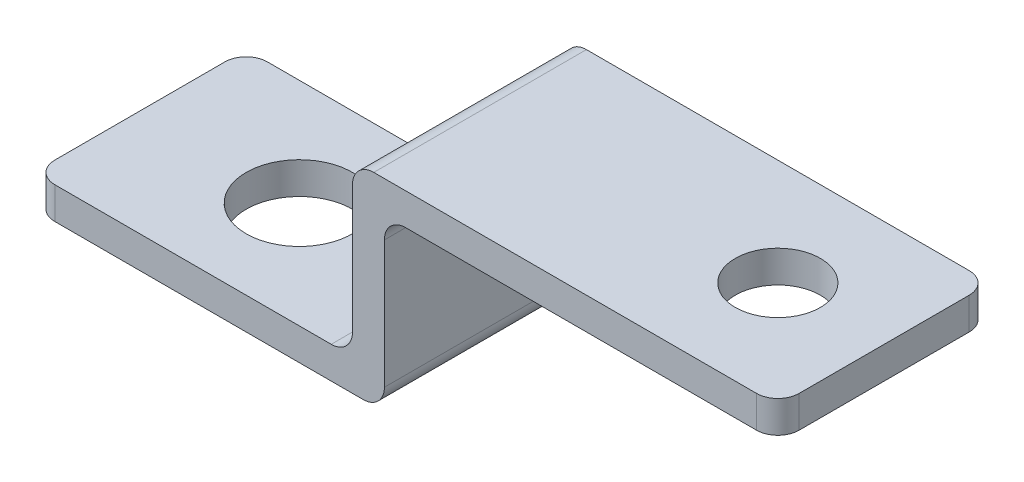
ISO-10303-21;
HEADER;
FILE_DESCRIPTION(('STEP AP214'),'2;1');
FILE_NAME('part.step','',(''),(''),'','','');
FILE_SCHEMA(('AUTOMOTIVE_DESIGN { 1 0 10303 214 1 1 1 1 }'));
ENDSEC;
DATA;
#1=APPLICATION_CONTEXT('core data for automotive mechanical design processes');
#2=APPLICATION_PROTOCOL_DEFINITION('international standard','automotive_design',2000,#1);
#3=PRODUCT_CONTEXT('',#1,'mechanical');
#4=PRODUCT('Part','Part','',(#3));
#5=PRODUCT_RELATED_PRODUCT_CATEGORY('part','',(#4));
#6=PRODUCT_DEFINITION_FORMATION('','',#4);
#7=PRODUCT_DEFINITION_CONTEXT('part definition',#1,'design');
#8=PRODUCT_DEFINITION('design','',#6,#7);
#9=PRODUCT_DEFINITION_SHAPE('','',#8);
#10=(LENGTH_UNIT() NAMED_UNIT(*) SI_UNIT(.MILLI.,.METRE.));
#11=(NAMED_UNIT(*) PLANE_ANGLE_UNIT() SI_UNIT($,.RADIAN.));
#12=(NAMED_UNIT(*) SI_UNIT($,.STERADIAN.) SOLID_ANGLE_UNIT());
#13=UNCERTAINTY_MEASURE_WITH_UNIT(LENGTH_MEASURE(1.E-05),#10,'distance_accuracy_value','');
#14=(GEOMETRIC_REPRESENTATION_CONTEXT(3) GLOBAL_UNCERTAINTY_ASSIGNED_CONTEXT((#13)) GLOBAL_UNIT_ASSIGNED_CONTEXT((#10,
#11,#12)) REPRESENTATION_CONTEXT('',''));
#15=CARTESIAN_POINT('',(0.,0.,0.));
#16=DIRECTION('',(0.,0.,1.));
#17=DIRECTION('',(1.,0.,0.));
#18=AXIS2_PLACEMENT_3D('',#15,#16,#17);
#19=CARTESIAN_POINT('',(15.,6.5,10.));
#20=DIRECTION('',(0.,1.,0.));
#21=DIRECTION('',(0.,0.,1.));
#22=AXIS2_PLACEMENT_3D('',#19,#20,#21);
#23=PLANE('',#22);
#24=CARTESIAN_POINT('',(30.,6.5,5.));
#25=DIRECTION('',(0.,1.,0.));
#26=DIRECTION('',(0.,0.,1.));
#27=AXIS2_PLACEMENT_3D('',#24,#25,#26);
#28=CIRCLE('',#27,2.);
#29=CARTESIAN_POINT('',(30.,6.5,7.));
#30=VERTEX_POINT('',#29);
#31=EDGE_CURVE('E324',#30,#30,#28,.T.);
#32=ORIENTED_EDGE('',*,*,#31,.T.);
#33=EDGE_LOOP('',(#32));
#34=FACE_BOUND('',#33,.T.);
#35=DIRECTION('',(1.,0.,0.));
#36=VECTOR('',#35,1.);
#37=CARTESIAN_POINT('',(15.,6.5,10.));
#38=LINE('',#37,#36);
#39=CARTESIAN_POINT('',(17.5,6.5,10.));
#40=VERTEX_POINT('',#39);
#41=CARTESIAN_POINT('',(34.,6.5,10.));
#42=VERTEX_POINT('',#41);
#43=EDGE_CURVE('E195',#40,#42,#38,.T.);
#44=ORIENTED_EDGE('',*,*,#43,.F.);
#45=DIRECTION('',(0.,0.,-1.));
#46=VECTOR('',#45,1.);
#47=CARTESIAN_POINT('',(17.5,6.5,0.));
#48=LINE('',#47,#46);
#49=CARTESIAN_POINT('',(17.5,6.5,0.));
#50=VERTEX_POINT('',#49);
#51=EDGE_CURVE('E227',#40,#50,#48,.T.);
#52=ORIENTED_EDGE('',*,*,#51,.T.);
#53=DIRECTION('',(1.,0.,0.));
#54=VECTOR('',#53,1.);
#55=CARTESIAN_POINT('',(15.,6.5,0.));
#56=LINE('',#55,#54);
#57=CARTESIAN_POINT('',(34.,6.5,0.));
#58=VERTEX_POINT('',#57);
#59=EDGE_CURVE('E297',#50,#58,#56,.T.);
#60=ORIENTED_EDGE('',*,*,#59,.T.);
#61=CARTESIAN_POINT('',(34.,6.5,1.));
#62=DIRECTION('',(0.,1.,0.));
#63=DIRECTION('',(0.,0.,1.));
#64=AXIS2_PLACEMENT_3D('',#61,#62,#63);
#65=CIRCLE('',#64,1.);
#66=CARTESIAN_POINT('',(35.,6.5,0.999999999999999));
#67=VERTEX_POINT('',#66);
#68=EDGE_CURVE('E221',#58,#67,#65,.F.);
#69=ORIENTED_EDGE('',*,*,#68,.T.);
#70=DIRECTION('',(0.,0.,-1.));
#71=VECTOR('',#70,1.);
#72=CARTESIAN_POINT('',(35.,6.5,10.));
#73=LINE('',#72,#71);
#74=CARTESIAN_POINT('',(35.,6.5,9.));
#75=VERTEX_POINT('',#74);
#76=EDGE_CURVE('E162',#75,#67,#73,.T.);
#77=ORIENTED_EDGE('',*,*,#76,.F.);
#78=CARTESIAN_POINT('',(34.,6.5,9.));
#79=DIRECTION('',(0.,1.,0.));
#80=DIRECTION('',(0.,0.,1.));
#81=AXIS2_PLACEMENT_3D('',#78,#79,#80);
#82=CIRCLE('',#81,1.);
#83=EDGE_CURVE('E224',#75,#42,#82,.F.);
#84=ORIENTED_EDGE('',*,*,#83,.T.);
#85=EDGE_LOOP('',(#44,#52,#60,#69,#77,#84));
#86=FACE_BOUND('',#85,.T.);
#87=ADVANCED_FACE('F39',(#34,#86),#23,.F.);
#88=CARTESIAN_POINT('',(35.,8.,10.));
#89=DIRECTION('',(1.,0.,0.));
#90=DIRECTION('',(0.,0.,-1.));
#91=AXIS2_PLACEMENT_3D('',#88,#89,#90);
#92=PLANE('',#91);
#93=DIRECTION('',(0.,0.,-1.));
#94=VECTOR('',#93,1.);
#95=CARTESIAN_POINT('',(35.,8.,10.));
#96=LINE('',#95,#94);
#97=CARTESIAN_POINT('',(35.,8.,9.));
#98=VERTEX_POINT('',#97);
#99=CARTESIAN_POINT('',(35.,8.,0.999999999999999));
#100=VERTEX_POINT('',#99);
#101=EDGE_CURVE('E203',#98,#100,#96,.T.);
#102=ORIENTED_EDGE('',*,*,#101,.F.);
#103=DIRECTION('',(0.,-1.,0.));
#104=VECTOR('',#103,1.);
#105=CARTESIAN_POINT('',(35.,6.5,9.));
#106=LINE('',#105,#104);
#107=EDGE_CURVE('E278',#98,#75,#106,.T.);
#108=ORIENTED_EDGE('',*,*,#107,.T.);
#109=ORIENTED_EDGE('',*,*,#76,.T.);
#110=DIRECTION('',(0.,-1.,0.));
#111=VECTOR('',#110,1.);
#112=CARTESIAN_POINT('',(35.,8.,0.999999999999999));
#113=LINE('',#112,#111);
#114=EDGE_CURVE('E275',#67,#100,#113,.F.);
#115=ORIENTED_EDGE('',*,*,#114,.T.);
#116=EDGE_LOOP('',(#102,#108,#109,#115));
#117=FACE_BOUND('',#116,.T.);
#118=ADVANCED_FACE('F352',(#117),#92,.T.);
#119=CARTESIAN_POINT('',(15.,8.,10.));
#120=DIRECTION('',(0.,1.,0.));
#121=DIRECTION('',(0.,0.,1.));
#122=AXIS2_PLACEMENT_3D('',#119,#120,#121);
#123=PLANE('',#122);
#124=CARTESIAN_POINT('',(30.,8.,5.));
#125=DIRECTION('',(0.,1.,0.));
#126=DIRECTION('',(0.,0.,1.));
#127=AXIS2_PLACEMENT_3D('',#124,#125,#126);
#128=CIRCLE('',#127,2.);
#129=CARTESIAN_POINT('',(30.,8.,7.));
#130=VERTEX_POINT('',#129);
#131=EDGE_CURVE('E550',#130,#130,#128,.T.);
#132=ORIENTED_EDGE('',*,*,#131,.F.);
#133=EDGE_LOOP('',(#132));
#134=FACE_BOUND('',#133,.T.);
#135=DIRECTION('',(1.,0.,0.));
#136=VECTOR('',#135,1.);
#137=CARTESIAN_POINT('',(15.,8.,0.));
#138=LINE('',#137,#136);
#139=CARTESIAN_POINT('',(16.,8.,0.));
#140=VERTEX_POINT('',#139);
#141=CARTESIAN_POINT('',(34.,8.,0.));
#142=VERTEX_POINT('',#141);
#143=EDGE_CURVE('E188',#140,#142,#138,.T.);
#144=ORIENTED_EDGE('',*,*,#143,.F.);
#145=DIRECTION('',(0.,0.,-1.));
#146=VECTOR('',#145,1.);
#147=CARTESIAN_POINT('',(16.,8.,10.));
#148=LINE('',#147,#146);
#149=CARTESIAN_POINT('',(16.,8.,10.));
#150=VERTEX_POINT('',#149);
#151=EDGE_CURVE('E252',#140,#150,#148,.F.);
#152=ORIENTED_EDGE('',*,*,#151,.T.);
#153=DIRECTION('',(1.,0.,0.));
#154=VECTOR('',#153,1.);
#155=CARTESIAN_POINT('',(15.,8.,10.));
#156=LINE('',#155,#154);
#157=CARTESIAN_POINT('',(34.,8.,10.));
#158=VERTEX_POINT('',#157);
#159=EDGE_CURVE('E317',#150,#158,#156,.T.);
#160=ORIENTED_EDGE('',*,*,#159,.T.);
#161=CARTESIAN_POINT('',(34.,8.,9.));
#162=DIRECTION('',(0.,1.,0.));
#163=DIRECTION('',(0.,0.,1.));
#164=AXIS2_PLACEMENT_3D('',#161,#162,#163);
#165=CIRCLE('',#164,1.);
#166=EDGE_CURVE('E249',#158,#98,#165,.T.);
#167=ORIENTED_EDGE('',*,*,#166,.T.);
#168=ORIENTED_EDGE('',*,*,#101,.T.);
#169=CARTESIAN_POINT('',(34.,8.,1.));
#170=DIRECTION('',(0.,1.,0.));
#171=DIRECTION('',(0.,0.,1.));
#172=AXIS2_PLACEMENT_3D('',#169,#170,#171);
#173=CIRCLE('',#172,1.);
#174=EDGE_CURVE('E246',#100,#142,#173,.T.);
#175=ORIENTED_EDGE('',*,*,#174,.T.);
#176=EDGE_LOOP('',(#144,#152,#160,#167,#168,#175));
#177=FACE_BOUND('',#176,.T.);
#178=ADVANCED_FACE('F358',(#134,#177),#123,.T.);
#179=CARTESIAN_POINT('',(15.,0.,10.));
#180=DIRECTION('',(-1.,0.,0.));
#181=DIRECTION('',(0.,0.,1.));
#182=AXIS2_PLACEMENT_3D('',#179,#180,#181);
#183=PLANE('',#182);
#184=DIRECTION('',(0.,1.,0.));
#185=VECTOR('',#184,1.);
#186=CARTESIAN_POINT('',(15.,0.,0.));
#187=LINE('',#186,#185);
#188=CARTESIAN_POINT('',(15.,1.,0.));
#189=VERTEX_POINT('',#188);
#190=CARTESIAN_POINT('',(15.,7.,0.));
#191=VERTEX_POINT('',#190);
#192=EDGE_CURVE('E182',#189,#191,#187,.T.);
#193=ORIENTED_EDGE('',*,*,#192,.F.);
#194=DIRECTION('',(0.,0.,-1.));
#195=VECTOR('',#194,1.);
#196=CARTESIAN_POINT('',(15.,1.,10.));
#197=LINE('',#196,#195);
#198=CARTESIAN_POINT('',(15.,1.,10.));
#199=VERTEX_POINT('',#198);
#200=EDGE_CURVE('E218',#189,#199,#197,.F.);
#201=ORIENTED_EDGE('',*,*,#200,.T.);
#202=DIRECTION('',(0.,1.,0.));
#203=VECTOR('',#202,1.);
#204=CARTESIAN_POINT('',(15.,0.,10.));
#205=LINE('',#204,#203);
#206=CARTESIAN_POINT('',(15.,7.,10.));
#207=VERTEX_POINT('',#206);
#208=EDGE_CURVE('E321',#199,#207,#205,.T.);
#209=ORIENTED_EDGE('',*,*,#208,.T.);
#210=DIRECTION('',(0.,0.,-1.));
#211=VECTOR('',#210,1.);
#212=CARTESIAN_POINT('',(15.,7.,10.));
#213=LINE('',#212,#211);
#214=EDGE_CURVE('E214',#207,#191,#213,.T.);
#215=ORIENTED_EDGE('',*,*,#214,.T.);
#216=EDGE_LOOP('',(#193,#201,#209,#215));
#217=FACE_BOUND('',#216,.T.);
#218=ADVANCED_FACE('F366',(#217),#183,.T.);
#219=CARTESIAN_POINT('',(0.,0.,10.));
#220=DIRECTION('',(0.,1.,0.));
#221=DIRECTION('',(0.,0.,1.));
#222=AXIS2_PLACEMENT_3D('',#219,#220,#221);
#223=PLANE('',#222);
#224=CARTESIAN_POINT('',(7.5,0.,5.));
#225=DIRECTION('',(0.,1.,0.));
#226=DIRECTION('',(0.,0.,1.));
#227=AXIS2_PLACEMENT_3D('',#224,#225,#226);
#228=CIRCLE('',#227,2.5);
#229=CARTESIAN_POINT('',(7.5,0.,7.5));
#230=VERTEX_POINT('',#229);
#231=EDGE_CURVE('E552',#230,#230,#228,.T.);
#232=ORIENTED_EDGE('',*,*,#231,.F.);
#233=EDGE_LOOP('',(#232));
#234=FACE_BOUND('',#233,.T.);
#235=DIRECTION('',(1.,0.,0.));
#236=VECTOR('',#235,1.);
#237=CARTESIAN_POINT('',(0.,0.,10.));
#238=LINE('',#237,#236);
#239=CARTESIAN_POINT('',(1.,0.,10.));
#240=VERTEX_POINT('',#239);
#241=CARTESIAN_POINT('',(14.,0.,10.));
#242=VERTEX_POINT('',#241);
#243=EDGE_CURVE('E330',#240,#242,#238,.T.);
#244=ORIENTED_EDGE('',*,*,#243,.T.);
#245=DIRECTION('',(0.,0.,-1.));
#246=VECTOR('',#245,1.);
#247=CARTESIAN_POINT('',(14.,0.,0.));
#248=LINE('',#247,#246);
#249=CARTESIAN_POINT('',(14.,0.,0.));
#250=VERTEX_POINT('',#249);
#251=EDGE_CURVE('E180',#242,#250,#248,.T.);
#252=ORIENTED_EDGE('',*,*,#251,.T.);
#253=DIRECTION('',(1.,0.,0.));
#254=VECTOR('',#253,1.);
#255=CARTESIAN_POINT('',(0.,0.,0.));
#256=LINE('',#255,#254);
#257=CARTESIAN_POINT('',(1.,0.,0.));
#258=VERTEX_POINT('',#257);
#259=EDGE_CURVE('E169',#258,#250,#256,.T.);
#260=ORIENTED_EDGE('',*,*,#259,.F.);
#261=CARTESIAN_POINT('',(1.,0.,1.));
#262=DIRECTION('',(0.,1.,0.));
#263=DIRECTION('',(0.,0.,1.));
#264=AXIS2_PLACEMENT_3D('',#261,#262,#263);
#265=CIRCLE('',#264,1.);
#266=CARTESIAN_POINT('',(0.,0.,0.999999999999999));
#267=VERTEX_POINT('',#266);
#268=EDGE_CURVE('E153',#258,#267,#265,.T.);
#269=ORIENTED_EDGE('',*,*,#268,.T.);
#270=DIRECTION('',(0.,0.,-1.));
#271=VECTOR('',#270,1.);
#272=CARTESIAN_POINT('',(0.,0.,10.));
#273=LINE('',#272,#271);
#274=CARTESIAN_POINT('',(0.,0.,9.));
#275=VERTEX_POINT('',#274);
#276=EDGE_CURVE('E199',#275,#267,#273,.T.);
#277=ORIENTED_EDGE('',*,*,#276,.F.);
#278=CARTESIAN_POINT('',(1.,0.,9.));
#279=DIRECTION('',(0.,1.,0.));
#280=DIRECTION('',(0.,0.,1.));
#281=AXIS2_PLACEMENT_3D('',#278,#279,#280);
#282=CIRCLE('',#281,1.);
#283=EDGE_CURVE('E161',#275,#240,#282,.T.);
#284=ORIENTED_EDGE('',*,*,#283,.T.);
#285=EDGE_LOOP('',(#244,#252,#260,#269,#277,#284));
#286=FACE_BOUND('',#285,.T.);
#287=ADVANCED_FACE('F178',(#234,#286),#223,.T.);
#288=CARTESIAN_POINT('',(0.,-1.5,10.));
#289=DIRECTION('',(-1.,0.,0.));
#290=DIRECTION('',(0.,0.,1.));
#291=AXIS2_PLACEMENT_3D('',#288,#289,#290);
#292=PLANE('',#291);
#293=DIRECTION('',(0.,0.,-1.));
#294=VECTOR('',#293,1.);
#295=CARTESIAN_POINT('',(0.,-1.5,10.));
#296=LINE('',#295,#294);
#297=CARTESIAN_POINT('',(0.,-1.5,9.));
#298=VERTEX_POINT('',#297);
#299=CARTESIAN_POINT('',(0.,-1.5,0.999999999999999));
#300=VERTEX_POINT('',#299);
#301=EDGE_CURVE('E196',#298,#300,#296,.T.);
#302=ORIENTED_EDGE('',*,*,#301,.F.);
#303=DIRECTION('',(0.,1.,0.));
#304=VECTOR('',#303,1.);
#305=CARTESIAN_POINT('',(0.,0.,9.));
#306=LINE('',#305,#304);
#307=EDGE_CURVE('E284',#298,#275,#306,.T.);
#308=ORIENTED_EDGE('',*,*,#307,.T.);
#309=ORIENTED_EDGE('',*,*,#276,.T.);
#310=DIRECTION('',(0.,1.,0.));
#311=VECTOR('',#310,1.);
#312=CARTESIAN_POINT('',(0.,-1.5,0.999999999999999));
#313=LINE('',#312,#311);
#314=EDGE_CURVE('E55',#267,#300,#313,.F.);
#315=ORIENTED_EDGE('',*,*,#314,.T.);
#316=EDGE_LOOP('',(#302,#308,#309,#315));
#317=FACE_BOUND('',#316,.T.);
#318=ADVANCED_FACE('F375',(#317),#292,.T.);
#319=CARTESIAN_POINT('',(0.,-1.5,10.));
#320=DIRECTION('',(0.,1.,0.));
#321=DIRECTION('',(0.,0.,1.));
#322=AXIS2_PLACEMENT_3D('',#319,#320,#321);
#323=PLANE('',#322);
#324=CARTESIAN_POINT('',(7.5,-1.5,5.));
#325=DIRECTION('',(0.,1.,0.));
#326=DIRECTION('',(0.,0.,1.));
#327=AXIS2_PLACEMENT_3D('',#324,#325,#326);
#328=CIRCLE('',#327,2.5);
#329=CARTESIAN_POINT('',(7.5,-1.5,7.5));
#330=VERTEX_POINT('',#329);
#331=EDGE_CURVE('E553',#330,#330,#328,.T.);
#332=ORIENTED_EDGE('',*,*,#331,.T.);
#333=EDGE_LOOP('',(#332));
#334=FACE_BOUND('',#333,.T.);
#335=DIRECTION('',(1.,0.,0.));
#336=VECTOR('',#335,1.);
#337=CARTESIAN_POINT('',(0.,-1.5,0.));
#338=LINE('',#337,#336);
#339=CARTESIAN_POINT('',(1.,-1.5,0.));
#340=VERTEX_POINT('',#339);
#341=CARTESIAN_POINT('',(15.5,-1.5,0.));
#342=VERTEX_POINT('',#341);
#343=EDGE_CURVE('E171',#340,#342,#338,.T.);
#344=ORIENTED_EDGE('',*,*,#343,.T.);
#345=DIRECTION('',(0.,0.,-1.));
#346=VECTOR('',#345,1.);
#347=CARTESIAN_POINT('',(15.5,-1.5,10.));
#348=LINE('',#347,#346);
#349=CARTESIAN_POINT('',(15.5,-1.5,10.));
#350=VERTEX_POINT('',#349);
#351=EDGE_CURVE('E272',#342,#350,#348,.F.);
#352=ORIENTED_EDGE('',*,*,#351,.T.);
#353=DIRECTION('',(1.,0.,0.));
#354=VECTOR('',#353,1.);
#355=CARTESIAN_POINT('',(0.,-1.5,10.));
#356=LINE('',#355,#354);
#357=CARTESIAN_POINT('',(1.,-1.5,10.));
#358=VERTEX_POINT('',#357);
#359=EDGE_CURVE('E333',#358,#350,#356,.T.);
#360=ORIENTED_EDGE('',*,*,#359,.F.);
#361=CARTESIAN_POINT('',(1.,-1.5,9.));
#362=DIRECTION('',(0.,1.,0.));
#363=DIRECTION('',(0.,0.,1.));
#364=AXIS2_PLACEMENT_3D('',#361,#362,#363);
#365=CIRCLE('',#364,1.);
#366=EDGE_CURVE('E62',#358,#298,#365,.F.);
#367=ORIENTED_EDGE('',*,*,#366,.T.);
#368=ORIENTED_EDGE('',*,*,#301,.T.);
#369=CARTESIAN_POINT('',(1.,-1.5,1.));
#370=DIRECTION('',(0.,1.,0.));
#371=DIRECTION('',(0.,0.,1.));
#372=AXIS2_PLACEMENT_3D('',#369,#370,#371);
#373=CIRCLE('',#372,1.);
#374=EDGE_CURVE('E267',#300,#340,#373,.F.);
#375=ORIENTED_EDGE('',*,*,#374,.T.);
#376=EDGE_LOOP('',(#344,#352,#360,#367,#368,#375));
#377=FACE_BOUND('',#376,.T.);
#378=ADVANCED_FACE('F376',(#334,#377),#323,.F.);
#379=CARTESIAN_POINT('',(16.5,0.,10.));
#380=DIRECTION('',(-1.,0.,0.));
#381=DIRECTION('',(0.,0.,1.));
#382=AXIS2_PLACEMENT_3D('',#379,#380,#381);
#383=PLANE('',#382);
#384=DIRECTION('',(0.,1.,0.));
#385=VECTOR('',#384,1.);
#386=CARTESIAN_POINT('',(16.5,0.,0.));
#387=LINE('',#386,#385);
#388=CARTESIAN_POINT('',(16.5,-0.5,0.));
#389=VERTEX_POINT('',#388);
#390=CARTESIAN_POINT('',(16.5,5.5,0.));
#391=VERTEX_POINT('',#390);
#392=EDGE_CURVE('E186',#389,#391,#387,.T.);
#393=ORIENTED_EDGE('',*,*,#392,.T.);
#394=DIRECTION('',(0.,0.,-1.));
#395=VECTOR('',#394,1.);
#396=CARTESIAN_POINT('',(16.5,5.5,10.));
#397=LINE('',#396,#395);
#398=CARTESIAN_POINT('',(16.5,5.5,10.));
#399=VERTEX_POINT('',#398);
#400=EDGE_CURVE('E174',#391,#399,#397,.F.);
#401=ORIENTED_EDGE('',*,*,#400,.T.);
#402=DIRECTION('',(0.,1.,0.));
#403=VECTOR('',#402,1.);
#404=CARTESIAN_POINT('',(16.5,0.,10.));
#405=LINE('',#404,#403);
#406=CARTESIAN_POINT('',(16.5,-0.5,10.));
#407=VERTEX_POINT('',#406);
#408=EDGE_CURVE('E200',#407,#399,#405,.T.);
#409=ORIENTED_EDGE('',*,*,#408,.F.);
#410=DIRECTION('',(0.,0.,-1.));
#411=VECTOR('',#410,1.);
#412=CARTESIAN_POINT('',(16.5,-0.5,10.));
#413=LINE('',#412,#411);
#414=EDGE_CURVE('E231',#407,#389,#413,.T.);
#415=ORIENTED_EDGE('',*,*,#414,.T.);
#416=EDGE_LOOP('',(#393,#401,#409,#415));
#417=FACE_BOUND('',#416,.T.);
#418=ADVANCED_FACE('F302',(#417),#383,.F.);
#419=CARTESIAN_POINT('',(0.,0.,10.));
#420=DIRECTION('',(0.,0.,-1.));
#421=DIRECTION('',(-1.,0.,0.));
#422=AXIS2_PLACEMENT_3D('',#419,#420,#421);
#423=PLANE('',#422);
#424=ORIENTED_EDGE('',*,*,#159,.F.);
#425=CARTESIAN_POINT('',(16.,7.,10.));
#426=DIRECTION('',(0.,0.,-1.));
#427=DIRECTION('',(-1.,0.,0.));
#428=AXIS2_PLACEMENT_3D('',#425,#426,#427);
#429=CIRCLE('',#428,1.);
#430=EDGE_CURVE('E264',#150,#207,#429,.F.);
#431=ORIENTED_EDGE('',*,*,#430,.T.);
#432=ORIENTED_EDGE('',*,*,#208,.F.);
#433=CARTESIAN_POINT('',(14.,1.,10.));
#434=DIRECTION('',(0.,0.,-1.));
#435=DIRECTION('',(-1.,0.,0.));
#436=AXIS2_PLACEMENT_3D('',#433,#434,#435);
#437=CIRCLE('',#436,1.);
#438=EDGE_CURVE('E291',#199,#242,#437,.T.);
#439=ORIENTED_EDGE('',*,*,#438,.T.);
#440=ORIENTED_EDGE('',*,*,#243,.F.);
#441=DIRECTION('',(0.,1.,0.));
#442=VECTOR('',#441,1.);
#443=CARTESIAN_POINT('',(1.,-1.5,10.));
#444=LINE('',#443,#442);
#445=EDGE_CURVE('E255',#240,#358,#444,.F.);
#446=ORIENTED_EDGE('',*,*,#445,.T.);
#447=ORIENTED_EDGE('',*,*,#359,.T.);
#448=CARTESIAN_POINT('',(15.5,-0.5,10.));
#449=DIRECTION('',(0.,0.,-1.));
#450=DIRECTION('',(-1.,0.,0.));
#451=AXIS2_PLACEMENT_3D('',#448,#449,#450);
#452=CIRCLE('',#451,1.);
#453=EDGE_CURVE('E261',#350,#407,#452,.F.);
#454=ORIENTED_EDGE('',*,*,#453,.T.);
#455=ORIENTED_EDGE('',*,*,#408,.T.);
#456=CARTESIAN_POINT('',(17.5,5.5,10.));
#457=DIRECTION('',(0.,0.,-1.));
#458=DIRECTION('',(-1.,0.,0.));
#459=AXIS2_PLACEMENT_3D('',#456,#457,#458);
#460=CIRCLE('',#459,1.);
#461=EDGE_CURVE('E11',#399,#40,#460,.T.);
#462=ORIENTED_EDGE('',*,*,#461,.T.);
#463=ORIENTED_EDGE('',*,*,#43,.T.);
#464=DIRECTION('',(0.,-1.,0.));
#465=VECTOR('',#464,1.);
#466=CARTESIAN_POINT('',(34.,8.,10.));
#467=LINE('',#466,#465);
#468=EDGE_CURVE('E258',#42,#158,#467,.F.);
#469=ORIENTED_EDGE('',*,*,#468,.T.);
#470=EDGE_LOOP('',(#424,#431,#432,#439,#440,#446,#447,#454,#455,#462,#463,#469));
#471=FACE_BOUND('',#470,.T.);
#472=ADVANCED_FACE('F312',(#471),#423,.F.);
#473=CARTESIAN_POINT('',(0.,0.,0.));
#474=DIRECTION('',(0.,0.,-1.));
#475=DIRECTION('',(-1.,0.,0.));
#476=AXIS2_PLACEMENT_3D('',#473,#474,#475);
#477=PLANE('',#476);
#478=ORIENTED_EDGE('',*,*,#192,.T.);
#479=CARTESIAN_POINT('',(16.,7.,0.));
#480=DIRECTION('',(0.,0.,-1.));
#481=DIRECTION('',(-1.,0.,0.));
#482=AXIS2_PLACEMENT_3D('',#479,#480,#481);
#483=CIRCLE('',#482,1.);
#484=EDGE_CURVE('E243',#191,#140,#483,.T.);
#485=ORIENTED_EDGE('',*,*,#484,.T.);
#486=ORIENTED_EDGE('',*,*,#143,.T.);
#487=DIRECTION('',(0.,-1.,0.));
#488=VECTOR('',#487,1.);
#489=CARTESIAN_POINT('',(34.,0.,0.));
#490=LINE('',#489,#488);
#491=EDGE_CURVE('E173',#142,#58,#490,.T.);
#492=ORIENTED_EDGE('',*,*,#491,.T.);
#493=ORIENTED_EDGE('',*,*,#59,.F.);
#494=CARTESIAN_POINT('',(17.5,5.5,0.));
#495=DIRECTION('',(0.,0.,-1.));
#496=DIRECTION('',(-1.,0.,0.));
#497=AXIS2_PLACEMENT_3D('',#494,#495,#496);
#498=CIRCLE('',#497,1.);
#499=EDGE_CURVE('E48',#50,#391,#498,.F.);
#500=ORIENTED_EDGE('',*,*,#499,.T.);
#501=ORIENTED_EDGE('',*,*,#392,.F.);
#502=CARTESIAN_POINT('',(15.5,-0.5,0.));
#503=DIRECTION('',(0.,0.,-1.));
#504=DIRECTION('',(-1.,0.,0.));
#505=AXIS2_PLACEMENT_3D('',#502,#503,#504);
#506=CIRCLE('',#505,1.);
#507=EDGE_CURVE('E240',#389,#342,#506,.T.);
#508=ORIENTED_EDGE('',*,*,#507,.T.);
#509=ORIENTED_EDGE('',*,*,#343,.F.);
#510=DIRECTION('',(0.,1.,0.));
#511=VECTOR('',#510,1.);
#512=CARTESIAN_POINT('',(1.,0.,0.));
#513=LINE('',#512,#511);
#514=EDGE_CURVE('E156',#340,#258,#513,.T.);
#515=ORIENTED_EDGE('',*,*,#514,.T.);
#516=ORIENTED_EDGE('',*,*,#259,.T.);
#517=CARTESIAN_POINT('',(14.,1.,0.));
#518=DIRECTION('',(0.,0.,-1.));
#519=DIRECTION('',(-1.,0.,0.));
#520=AXIS2_PLACEMENT_3D('',#517,#518,#519);
#521=CIRCLE('',#520,1.);
#522=EDGE_CURVE('E288',#250,#189,#521,.F.);
#523=ORIENTED_EDGE('',*,*,#522,.T.);
#524=EDGE_LOOP('',(#478,#485,#486,#492,#493,#500,#501,#508,#509,#515,#516,#523));
#525=FACE_BOUND('',#524,.T.);
#526=ADVANCED_FACE('F168',(#525),#477,.T.);
#527=CARTESIAN_POINT('',(7.5,-1.5,5.));
#528=DIRECTION('',(0.,1.,0.));
#529=DIRECTION('',(0.,0.,1.));
#530=AXIS2_PLACEMENT_3D('',#527,#528,#529);
#531=CYLINDRICAL_SURFACE('',#530,2.5);
#532=ORIENTED_EDGE('',*,*,#231,.T.);
#533=EDGE_LOOP('',(#532));
#534=FACE_BOUND('',#533,.T.);
#535=ORIENTED_EDGE('',*,*,#331,.F.);
#536=EDGE_LOOP('',(#535));
#537=FACE_BOUND('',#536,.T.);
#538=ADVANCED_FACE('F460',(#534,#537),#531,.F.);
#539=CARTESIAN_POINT('',(30.,-1.5,5.));
#540=DIRECTION('',(0.,1.,0.));
#541=DIRECTION('',(0.,0.,1.));
#542=AXIS2_PLACEMENT_3D('',#539,#540,#541);
#543=CYLINDRICAL_SURFACE('',#542,2.);
#544=ORIENTED_EDGE('',*,*,#131,.T.);
#545=EDGE_LOOP('',(#544));
#546=FACE_BOUND('',#545,.T.);
#547=ORIENTED_EDGE('',*,*,#31,.F.);
#548=EDGE_LOOP('',(#547));
#549=FACE_BOUND('',#548,.T.);
#550=ADVANCED_FACE('F401',(#546,#549),#543,.F.);
#551=CARTESIAN_POINT('',(14.,1.,10.));
#552=DIRECTION('',(0.,0.,1.));
#553=DIRECTION('',(1.,0.,0.));
#554=AXIS2_PLACEMENT_3D('',#551,#552,#553);
#555=CYLINDRICAL_SURFACE('',#554,1.);
#556=ORIENTED_EDGE('',*,*,#438,.F.);
#557=ORIENTED_EDGE('',*,*,#200,.F.);
#558=ORIENTED_EDGE('',*,*,#522,.F.);
#559=ORIENTED_EDGE('',*,*,#251,.F.);
#560=EDGE_LOOP('',(#556,#557,#558,#559));
#561=FACE_BOUND('',#560,.T.);
#562=ADVANCED_FACE('F369',(#561),#555,.F.);
#563=CARTESIAN_POINT('',(17.5,5.5,10.));
#564=DIRECTION('',(0.,0.,1.));
#565=DIRECTION('',(1.,0.,0.));
#566=AXIS2_PLACEMENT_3D('',#563,#564,#565);
#567=CYLINDRICAL_SURFACE('',#566,1.);
#568=ORIENTED_EDGE('',*,*,#461,.F.);
#569=ORIENTED_EDGE('',*,*,#400,.F.);
#570=ORIENTED_EDGE('',*,*,#499,.F.);
#571=ORIENTED_EDGE('',*,*,#51,.F.);
#572=EDGE_LOOP('',(#568,#569,#570,#571));
#573=FACE_BOUND('',#572,.T.);
#574=ADVANCED_FACE('F307',(#573),#567,.F.);
#575=CARTESIAN_POINT('',(16.,7.,10.));
#576=DIRECTION('',(0.,0.,-1.));
#577=DIRECTION('',(-1.,0.,0.));
#578=AXIS2_PLACEMENT_3D('',#575,#576,#577);
#579=CYLINDRICAL_SURFACE('',#578,1.);
#580=ORIENTED_EDGE('',*,*,#430,.F.);
#581=ORIENTED_EDGE('',*,*,#151,.F.);
#582=ORIENTED_EDGE('',*,*,#484,.F.);
#583=ORIENTED_EDGE('',*,*,#214,.F.);
#584=EDGE_LOOP('',(#580,#581,#582,#583));
#585=FACE_BOUND('',#584,.T.);
#586=ADVANCED_FACE('F360',(#585),#579,.T.);
#587=CARTESIAN_POINT('',(15.5,-0.5,10.));
#588=DIRECTION('',(0.,0.,-1.));
#589=DIRECTION('',(-1.,0.,0.));
#590=AXIS2_PLACEMENT_3D('',#587,#588,#589);
#591=CYLINDRICAL_SURFACE('',#590,1.);
#592=ORIENTED_EDGE('',*,*,#453,.F.);
#593=ORIENTED_EDGE('',*,*,#351,.F.);
#594=ORIENTED_EDGE('',*,*,#507,.F.);
#595=ORIENTED_EDGE('',*,*,#414,.F.);
#596=EDGE_LOOP('',(#592,#593,#594,#595));
#597=FACE_BOUND('',#596,.T.);
#598=ADVANCED_FACE('F380',(#597),#591,.T.);
#599=CARTESIAN_POINT('',(34.,8.,9.));
#600=DIRECTION('',(0.,1.,0.));
#601=DIRECTION('',(0.,0.,1.));
#602=AXIS2_PLACEMENT_3D('',#599,#600,#601);
#603=CYLINDRICAL_SURFACE('',#602,1.);
#604=ORIENTED_EDGE('',*,*,#166,.F.);
#605=ORIENTED_EDGE('',*,*,#468,.F.);
#606=ORIENTED_EDGE('',*,*,#83,.F.);
#607=ORIENTED_EDGE('',*,*,#107,.F.);
#608=EDGE_LOOP('',(#604,#605,#606,#607));
#609=FACE_BOUND('',#608,.T.);
#610=ADVANCED_FACE('F356',(#609),#603,.T.);
#611=CARTESIAN_POINT('',(34.,0.,1.));
#612=DIRECTION('',(0.,-1.,0.));
#613=DIRECTION('',(0.,0.,-1.));
#614=AXIS2_PLACEMENT_3D('',#611,#612,#613);
#615=CYLINDRICAL_SURFACE('',#614,1.);
#616=ORIENTED_EDGE('',*,*,#174,.F.);
#617=ORIENTED_EDGE('',*,*,#114,.F.);
#618=ORIENTED_EDGE('',*,*,#68,.F.);
#619=ORIENTED_EDGE('',*,*,#491,.F.);
#620=EDGE_LOOP('',(#616,#617,#618,#619));
#621=FACE_BOUND('',#620,.T.);
#622=ADVANCED_FACE('F348',(#621),#615,.T.);
#623=CARTESIAN_POINT('',(1.,-1.5,9.));
#624=DIRECTION('',(0.,-1.,0.));
#625=DIRECTION('',(0.,0.,-1.));
#626=AXIS2_PLACEMENT_3D('',#623,#624,#625);
#627=CYLINDRICAL_SURFACE('',#626,1.);
#628=ORIENTED_EDGE('',*,*,#366,.F.);
#629=ORIENTED_EDGE('',*,*,#445,.F.);
#630=ORIENTED_EDGE('',*,*,#283,.F.);
#631=ORIENTED_EDGE('',*,*,#307,.F.);
#632=EDGE_LOOP('',(#628,#629,#630,#631));
#633=FACE_BOUND('',#632,.T.);
#634=ADVANCED_FACE('F374',(#633),#627,.T.);
#635=CARTESIAN_POINT('',(1.,0.,1.));
#636=DIRECTION('',(0.,1.,0.));
#637=DIRECTION('',(0.,0.,1.));
#638=AXIS2_PLACEMENT_3D('',#635,#636,#637);
#639=CYLINDRICAL_SURFACE('',#638,1.);
#640=ORIENTED_EDGE('',*,*,#374,.F.);
#641=ORIENTED_EDGE('',*,*,#314,.F.);
#642=ORIENTED_EDGE('',*,*,#268,.F.);
#643=ORIENTED_EDGE('',*,*,#514,.F.);
#644=EDGE_LOOP('',(#640,#641,#642,#643));
#645=FACE_BOUND('',#644,.T.);
#646=ADVANCED_FACE('F41',(#645),#639,.T.);
#647=CLOSED_SHELL('',(#87,#118,#178,#218,#287,#318,#378,#418,#472,#526,#538,#550,#562,#574,#586,
#598,#610,#622,#634,#646));
#648=MANIFOLD_SOLID_BREP('B2',#647);
#649=ADVANCED_BREP_SHAPE_REPRESENTATION('',(#18,#648),#14);
#650=SHAPE_DEFINITION_REPRESENTATION(#9,#649);
ENDSEC;
END-ISO-10303-21;
